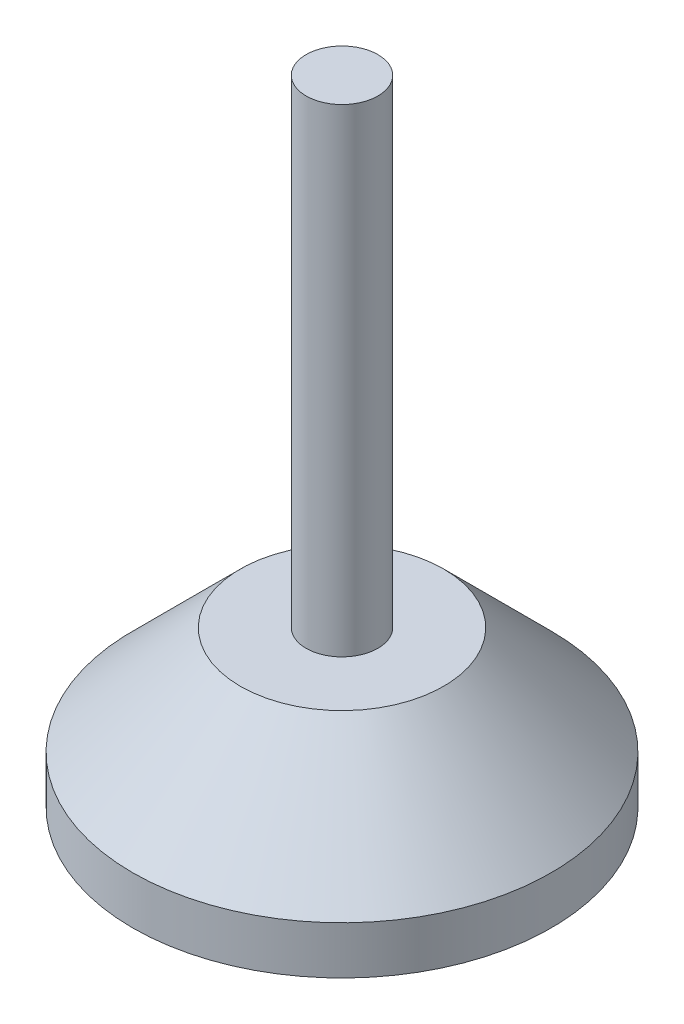
ISO-10303-21;
HEADER;
FILE_DESCRIPTION(('STEP AP214'),'2;1');
FILE_NAME('part.step','',(''),(''),'','','');
FILE_SCHEMA(('AUTOMOTIVE_DESIGN { 1 0 10303 214 1 1 1 1 }'));
ENDSEC;
DATA;
#1=APPLICATION_CONTEXT('core data for automotive mechanical design processes');
#2=APPLICATION_PROTOCOL_DEFINITION('international standard','automotive_design',2000,#1);
#3=PRODUCT_CONTEXT('',#1,'mechanical');
#4=PRODUCT('Part','Part','',(#3));
#5=PRODUCT_RELATED_PRODUCT_CATEGORY('part','',(#4));
#6=PRODUCT_DEFINITION_FORMATION('','',#4);
#7=PRODUCT_DEFINITION_CONTEXT('part definition',#1,'design');
#8=PRODUCT_DEFINITION('design','',#6,#7);
#9=PRODUCT_DEFINITION_SHAPE('','',#8);
#10=(LENGTH_UNIT() NAMED_UNIT(*) SI_UNIT(.MILLI.,.METRE.));
#11=(NAMED_UNIT(*) PLANE_ANGLE_UNIT() SI_UNIT($,.RADIAN.));
#12=(NAMED_UNIT(*) SI_UNIT($,.STERADIAN.) SOLID_ANGLE_UNIT());
#13=UNCERTAINTY_MEASURE_WITH_UNIT(LENGTH_MEASURE(1.E-05),#10,'distance_accuracy_value','');
#14=(GEOMETRIC_REPRESENTATION_CONTEXT(3) GLOBAL_UNCERTAINTY_ASSIGNED_CONTEXT((#13)) GLOBAL_UNIT_ASSIGNED_CONTEXT((#10,
#11,#12)) REPRESENTATION_CONTEXT('',''));
#15=CARTESIAN_POINT('',(0.,0.,0.));
#16=DIRECTION('',(0.,0.,1.));
#17=DIRECTION('',(1.,0.,0.));
#18=AXIS2_PLACEMENT_3D('',#15,#16,#17);
#19=CARTESIAN_POINT('',(0.,0.,0.));
#20=DIRECTION('',(0.,-1.,0.));
#21=DIRECTION('',(0.,0.,-1.));
#22=AXIS2_PLACEMENT_3D('',#19,#20,#21);
#23=PLANE('',#22);
#24=CARTESIAN_POINT('',(0.,0.,0.));
#25=DIRECTION('',(0.,-1.,0.));
#26=DIRECTION('',(0.,0.,-1.));
#27=AXIS2_PLACEMENT_3D('',#24,#25,#26);
#28=CIRCLE('',#27,27.78125);
#29=CARTESIAN_POINT('',(0.,0.,-27.78125));
#30=VERTEX_POINT('',#29);
#31=EDGE_CURVE('E10',#30,#30,#28,.T.);
#32=ORIENTED_EDGE('',*,*,#31,.T.);
#33=EDGE_LOOP('',(#32));
#34=FACE_BOUND('',#33,.T.);
#35=ADVANCED_FACE('F35',(#34),#23,.T.);
#36=CARTESIAN_POINT('',(0.,0.745681744566531,0.));
#37=DIRECTION('',(0.,-1.,0.));
#38=DIRECTION('',(0.,0.,-1.));
#39=AXIS2_PLACEMENT_3D('',#36,#37,#38);
#40=CYLINDRICAL_SURFACE('',#39,27.78125);
#41=CARTESIAN_POINT('',(0.,6.35,0.));
#42=DIRECTION('',(0.,-1.,0.));
#43=DIRECTION('',(0.,0.,-1.));
#44=AXIS2_PLACEMENT_3D('',#41,#42,#43);
#45=CIRCLE('',#44,27.78125);
#46=CARTESIAN_POINT('',(0.,6.35,-27.78125));
#47=VERTEX_POINT('',#46);
#48=EDGE_CURVE('E41',#47,#47,#45,.T.);
#49=ORIENTED_EDGE('',*,*,#48,.T.);
#50=EDGE_LOOP('',(#49));
#51=FACE_BOUND('',#50,.T.);
#52=ORIENTED_EDGE('',*,*,#31,.F.);
#53=EDGE_LOOP('',(#52));
#54=FACE_BOUND('',#53,.T.);
#55=ADVANCED_FACE('F70',(#51,#54),#40,.T.);
#56=CARTESIAN_POINT('',(0.,6.35,0.));
#57=DIRECTION('',(0.,-1.,0.));
#58=DIRECTION('',(0.,0.,-1.));
#59=AXIS2_PLACEMENT_3D('',#56,#57,#58);
#60=CONICAL_SURFACE('',#59,27.78125,0.785398163397454);
#61=CARTESIAN_POINT('',(0.,20.6375,0.));
#62=DIRECTION('',(0.,-1.,0.));
#63=DIRECTION('',(0.,0.,-1.));
#64=AXIS2_PLACEMENT_3D('',#61,#62,#63);
#65=CIRCLE('',#64,13.4937499999998);
#66=CARTESIAN_POINT('',(0.,20.6375,-13.4937499999998));
#67=VERTEX_POINT('',#66);
#68=EDGE_CURVE('E45',#67,#67,#65,.T.);
#69=ORIENTED_EDGE('',*,*,#68,.T.);
#70=EDGE_LOOP('',(#69));
#71=FACE_BOUND('',#70,.T.);
#72=ORIENTED_EDGE('',*,*,#48,.F.);
#73=EDGE_LOOP('',(#72));
#74=FACE_BOUND('',#73,.T.);
#75=ADVANCED_FACE('F74',(#71,#74),#60,.T.);
#76=CARTESIAN_POINT('',(0.,20.6375,-13.4937499999998));
#77=DIRECTION('',(0.,1.,0.));
#78=DIRECTION('',(0.,0.,1.));
#79=AXIS2_PLACEMENT_3D('',#76,#77,#78);
#80=PLANE('',#79);
#81=CARTESIAN_POINT('',(0.,20.6375,0.));
#82=DIRECTION('',(0.,-1.,0.));
#83=DIRECTION('',(0.,0.,-1.));
#84=AXIS2_PLACEMENT_3D('',#81,#82,#83);
#85=CIRCLE('',#84,4.7625);
#86=CARTESIAN_POINT('',(0.,20.6375,-4.7625));
#87=VERTEX_POINT('',#86);
#88=EDGE_CURVE('E49',#87,#87,#85,.T.);
#89=ORIENTED_EDGE('',*,*,#88,.T.);
#90=EDGE_LOOP('',(#89));
#91=FACE_BOUND('',#90,.T.);
#92=ORIENTED_EDGE('',*,*,#68,.F.);
#93=EDGE_LOOP('',(#92));
#94=FACE_BOUND('',#93,.T.);
#95=ADVANCED_FACE('F67',(#91,#94),#80,.T.);
#96=CARTESIAN_POINT('',(0.,0.745681744566531,0.));
#97=DIRECTION('',(0.,-1.,0.));
#98=DIRECTION('',(0.,0.,-1.));
#99=AXIS2_PLACEMENT_3D('',#96,#97,#98);
#100=CYLINDRICAL_SURFACE('',#99,4.7625);
#101=CARTESIAN_POINT('',(0.,84.1375,0.));
#102=DIRECTION('',(0.,-1.,0.));
#103=DIRECTION('',(0.,0.,-1.));
#104=AXIS2_PLACEMENT_3D('',#101,#102,#103);
#105=CIRCLE('',#104,4.7625);
#106=CARTESIAN_POINT('',(0.,84.1375,-4.7625));
#107=VERTEX_POINT('',#106);
#108=EDGE_CURVE('E54',#107,#107,#105,.T.);
#109=ORIENTED_EDGE('',*,*,#108,.T.);
#110=EDGE_LOOP('',(#109));
#111=FACE_BOUND('',#110,.T.);
#112=ORIENTED_EDGE('',*,*,#88,.F.);
#113=EDGE_LOOP('',(#112));
#114=FACE_BOUND('',#113,.T.);
#115=ADVANCED_FACE('F58',(#111,#114),#100,.T.);
#116=CARTESIAN_POINT('',(0.,84.1375,-4.7625));
#117=DIRECTION('',(0.,1.,0.));
#118=DIRECTION('',(0.,0.,1.));
#119=AXIS2_PLACEMENT_3D('',#116,#117,#118);
#120=PLANE('',#119);
#121=ORIENTED_EDGE('',*,*,#108,.F.);
#122=EDGE_LOOP('',(#121));
#123=FACE_BOUND('',#122,.T.);
#124=ADVANCED_FACE('F61',(#123),#120,.T.);
#125=CLOSED_SHELL('',(#35,#55,#75,#95,#115,#124));
#126=MANIFOLD_SOLID_BREP('B2',#125);
#127=ADVANCED_BREP_SHAPE_REPRESENTATION('',(#18,#126),#14);
#128=SHAPE_DEFINITION_REPRESENTATION(#9,#127);
ENDSEC;
END-ISO-10303-21;
